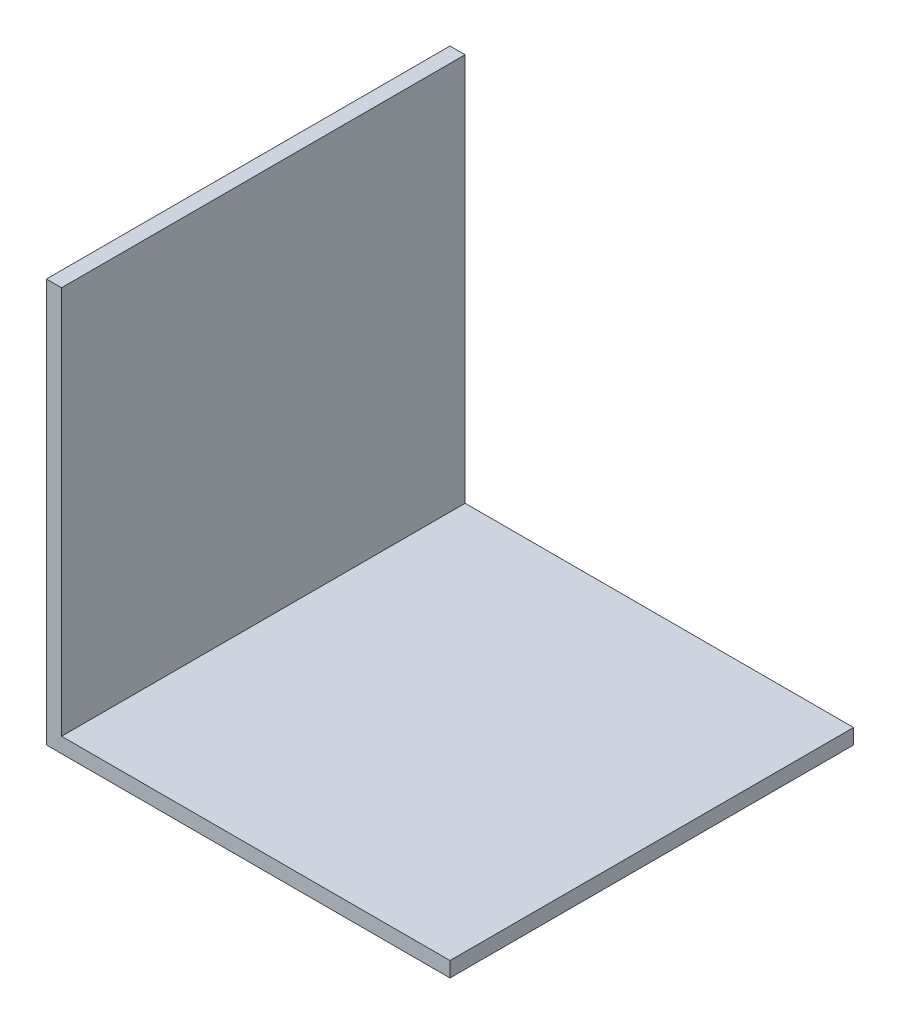
ISO-10303-21;
HEADER;
FILE_DESCRIPTION(('STEP AP214'),'2;1');
FILE_NAME('part.step','',(''),(''),'','','');
FILE_SCHEMA(('AUTOMOTIVE_DESIGN { 1 0 10303 214 1 1 1 1 }'));
ENDSEC;
DATA;
#1=APPLICATION_CONTEXT('core data for automotive mechanical design processes');
#2=APPLICATION_PROTOCOL_DEFINITION('international standard','automotive_design',2000,#1);
#3=PRODUCT_CONTEXT('',#1,'mechanical');
#4=PRODUCT('Part','Part','',(#3));
#5=PRODUCT_RELATED_PRODUCT_CATEGORY('part','',(#4));
#6=PRODUCT_DEFINITION_FORMATION('','',#4);
#7=PRODUCT_DEFINITION_CONTEXT('part definition',#1,'design');
#8=PRODUCT_DEFINITION('design','',#6,#7);
#9=PRODUCT_DEFINITION_SHAPE('','',#8);
#10=(LENGTH_UNIT() NAMED_UNIT(*) SI_UNIT(.MILLI.,.METRE.));
#11=(NAMED_UNIT(*) PLANE_ANGLE_UNIT() SI_UNIT($,.RADIAN.));
#12=(NAMED_UNIT(*) SI_UNIT($,.STERADIAN.) SOLID_ANGLE_UNIT());
#13=UNCERTAINTY_MEASURE_WITH_UNIT(LENGTH_MEASURE(1.E-05),#10,'distance_accuracy_value','');
#14=(GEOMETRIC_REPRESENTATION_CONTEXT(3) GLOBAL_UNCERTAINTY_ASSIGNED_CONTEXT((#13)) GLOBAL_UNIT_ASSIGNED_CONTEXT((#10,
#11,#12)) REPRESENTATION_CONTEXT('',''));
#15=CARTESIAN_POINT('',(0.,0.,0.));
#16=DIRECTION('',(0.,0.,1.));
#17=DIRECTION('',(1.,0.,0.));
#18=AXIS2_PLACEMENT_3D('',#15,#16,#17);
#19=CARTESIAN_POINT('',(0.,40.,40.));
#20=DIRECTION('',(1.,0.,0.));
#21=DIRECTION('',(0.,1.,0.));
#22=AXIS2_PLACEMENT_3D('',#19,#20,#21);
#23=PLANE('',#22);
#24=DIRECTION('',(0.,-1.,0.));
#25=VECTOR('',#24,1.);
#26=CARTESIAN_POINT('',(0.,40.,0.));
#27=LINE('',#26,#25);
#28=CARTESIAN_POINT('',(0.,40.,0.));
#29=VERTEX_POINT('',#28);
#30=CARTESIAN_POINT('',(0.,0.,0.));
#31=VERTEX_POINT('',#30);
#32=EDGE_CURVE('E117',#29,#31,#27,.T.);
#33=ORIENTED_EDGE('',*,*,#32,.T.);
#34=DIRECTION('',(0.,0.,-1.));
#35=VECTOR('',#34,1.);
#36=CARTESIAN_POINT('',(0.,0.,40.));
#37=LINE('',#36,#35);
#38=CARTESIAN_POINT('',(0.,0.,40.));
#39=VERTEX_POINT('',#38);
#40=EDGE_CURVE('E11',#39,#31,#37,.T.);
#41=ORIENTED_EDGE('',*,*,#40,.F.);
#42=DIRECTION('',(0.,-1.,0.));
#43=VECTOR('',#42,1.);
#44=CARTESIAN_POINT('',(0.,40.,40.));
#45=LINE('',#44,#43);
#46=CARTESIAN_POINT('',(0.,40.,40.));
#47=VERTEX_POINT('',#46);
#48=EDGE_CURVE('E127',#47,#39,#45,.T.);
#49=ORIENTED_EDGE('',*,*,#48,.F.);
#50=DIRECTION('',(0.,0.,-1.));
#51=VECTOR('',#50,1.);
#52=CARTESIAN_POINT('',(0.,40.,40.));
#53=LINE('',#52,#51);
#54=EDGE_CURVE('E113',#47,#29,#53,.T.);
#55=ORIENTED_EDGE('',*,*,#54,.T.);
#56=EDGE_LOOP('',(#33,#41,#49,#55));
#57=FACE_BOUND('',#56,.T.);
#58=ADVANCED_FACE('F33',(#57),#23,.F.);
#59=CARTESIAN_POINT('',(0.,0.,40.));
#60=DIRECTION('',(0.,1.,0.));
#61=DIRECTION('',(0.,0.,1.));
#62=AXIS2_PLACEMENT_3D('',#59,#60,#61);
#63=PLANE('',#62);
#64=DIRECTION('',(1.,0.,0.));
#65=VECTOR('',#64,1.);
#66=CARTESIAN_POINT('',(0.,0.,0.));
#67=LINE('',#66,#65);
#68=CARTESIAN_POINT('',(40.,0.,0.));
#69=VERTEX_POINT('',#68);
#70=EDGE_CURVE('E120',#31,#69,#67,.T.);
#71=ORIENTED_EDGE('',*,*,#70,.T.);
#72=DIRECTION('',(0.,0.,-1.));
#73=VECTOR('',#72,1.);
#74=CARTESIAN_POINT('',(40.,0.,40.));
#75=LINE('',#74,#73);
#76=CARTESIAN_POINT('',(40.,0.,40.));
#77=VERTEX_POINT('',#76);
#78=EDGE_CURVE('E41',#77,#69,#75,.T.);
#79=ORIENTED_EDGE('',*,*,#78,.F.);
#80=DIRECTION('',(1.,0.,0.));
#81=VECTOR('',#80,1.);
#82=CARTESIAN_POINT('',(0.,0.,40.));
#83=LINE('',#82,#81);
#84=EDGE_CURVE('E86',#39,#77,#83,.T.);
#85=ORIENTED_EDGE('',*,*,#84,.F.);
#86=ORIENTED_EDGE('',*,*,#40,.T.);
#87=EDGE_LOOP('',(#71,#79,#85,#86));
#88=FACE_BOUND('',#87,.T.);
#89=ADVANCED_FACE('F151',(#88),#63,.F.);
#90=CARTESIAN_POINT('',(40.,0.,40.));
#91=DIRECTION('',(-1.,0.,0.));
#92=DIRECTION('',(0.,0.,1.));
#93=AXIS2_PLACEMENT_3D('',#90,#91,#92);
#94=PLANE('',#93);
#95=DIRECTION('',(0.,1.,0.));
#96=VECTOR('',#95,1.);
#97=CARTESIAN_POINT('',(40.,0.,0.));
#98=LINE('',#97,#96);
#99=CARTESIAN_POINT('',(40.,1.5,0.));
#100=VERTEX_POINT('',#99);
#101=EDGE_CURVE('E122',#69,#100,#98,.T.);
#102=ORIENTED_EDGE('',*,*,#101,.T.);
#103=DIRECTION('',(0.,0.,-1.));
#104=VECTOR('',#103,1.);
#105=CARTESIAN_POINT('',(40.,1.5,40.));
#106=LINE('',#105,#104);
#107=CARTESIAN_POINT('',(40.,1.5,40.));
#108=VERTEX_POINT('',#107);
#109=EDGE_CURVE('E108',#108,#100,#106,.T.);
#110=ORIENTED_EDGE('',*,*,#109,.F.);
#111=DIRECTION('',(0.,1.,0.));
#112=VECTOR('',#111,1.);
#113=CARTESIAN_POINT('',(40.,0.,40.));
#114=LINE('',#113,#112);
#115=EDGE_CURVE('E99',#77,#108,#114,.T.);
#116=ORIENTED_EDGE('',*,*,#115,.F.);
#117=ORIENTED_EDGE('',*,*,#78,.T.);
#118=EDGE_LOOP('',(#102,#110,#116,#117));
#119=FACE_BOUND('',#118,.T.);
#120=ADVANCED_FACE('F133',(#119),#94,.F.);
#121=CARTESIAN_POINT('',(40.,1.5,40.));
#122=DIRECTION('',(0.,-1.,0.));
#123=DIRECTION('',(1.,0.,0.));
#124=AXIS2_PLACEMENT_3D('',#121,#122,#123);
#125=PLANE('',#124);
#126=DIRECTION('',(-1.,0.,0.));
#127=VECTOR('',#126,1.);
#128=CARTESIAN_POINT('',(40.,1.5,0.));
#129=LINE('',#128,#127);
#130=CARTESIAN_POINT('',(1.5,1.5,0.));
#131=VERTEX_POINT('',#130);
#132=EDGE_CURVE('E107',#100,#131,#129,.T.);
#133=ORIENTED_EDGE('',*,*,#132,.T.);
#134=DIRECTION('',(0.,0.,-1.));
#135=VECTOR('',#134,1.);
#136=CARTESIAN_POINT('',(1.5,1.5,40.));
#137=LINE('',#136,#135);
#138=CARTESIAN_POINT('',(1.5,1.5,40.));
#139=VERTEX_POINT('',#138);
#140=EDGE_CURVE('E104',#139,#131,#137,.T.);
#141=ORIENTED_EDGE('',*,*,#140,.F.);
#142=DIRECTION('',(-1.,0.,0.));
#143=VECTOR('',#142,1.);
#144=CARTESIAN_POINT('',(40.,1.5,40.));
#145=LINE('',#144,#143);
#146=EDGE_CURVE('E93',#108,#139,#145,.T.);
#147=ORIENTED_EDGE('',*,*,#146,.F.);
#148=ORIENTED_EDGE('',*,*,#109,.T.);
#149=EDGE_LOOP('',(#133,#141,#147,#148));
#150=FACE_BOUND('',#149,.T.);
#151=ADVANCED_FACE('F105',(#150),#125,.F.);
#152=CARTESIAN_POINT('',(1.5,1.5,40.));
#153=DIRECTION('',(-1.,0.,0.));
#154=DIRECTION('',(0.,-1.,0.));
#155=AXIS2_PLACEMENT_3D('',#152,#153,#154);
#156=PLANE('',#155);
#157=DIRECTION('',(0.,1.,0.));
#158=VECTOR('',#157,1.);
#159=CARTESIAN_POINT('',(1.5,1.5,0.));
#160=LINE('',#159,#158);
#161=CARTESIAN_POINT('',(1.5,40.,0.));
#162=VERTEX_POINT('',#161);
#163=EDGE_CURVE('E72',#131,#162,#160,.T.);
#164=ORIENTED_EDGE('',*,*,#163,.T.);
#165=DIRECTION('',(0.,0.,-1.));
#166=VECTOR('',#165,1.);
#167=CARTESIAN_POINT('',(1.5,40.,40.));
#168=LINE('',#167,#166);
#169=CARTESIAN_POINT('',(1.5,40.,40.));
#170=VERTEX_POINT('',#169);
#171=EDGE_CURVE('E109',#170,#162,#168,.T.);
#172=ORIENTED_EDGE('',*,*,#171,.F.);
#173=DIRECTION('',(0.,1.,0.));
#174=VECTOR('',#173,1.);
#175=CARTESIAN_POINT('',(1.5,1.5,40.));
#176=LINE('',#175,#174);
#177=EDGE_CURVE('E97',#139,#170,#176,.T.);
#178=ORIENTED_EDGE('',*,*,#177,.F.);
#179=ORIENTED_EDGE('',*,*,#140,.T.);
#180=EDGE_LOOP('',(#164,#172,#178,#179));
#181=FACE_BOUND('',#180,.T.);
#182=ADVANCED_FACE('F111',(#181),#156,.F.);
#183=CARTESIAN_POINT('',(1.5,40.,40.));
#184=DIRECTION('',(0.,-1.,0.));
#185=DIRECTION('',(0.,0.,-1.));
#186=AXIS2_PLACEMENT_3D('',#183,#184,#185);
#187=PLANE('',#186);
#188=DIRECTION('',(-1.,0.,0.));
#189=VECTOR('',#188,1.);
#190=CARTESIAN_POINT('',(1.5,40.,0.));
#191=LINE('',#190,#189);
#192=EDGE_CURVE('E78',#162,#29,#191,.T.);
#193=ORIENTED_EDGE('',*,*,#192,.T.);
#194=ORIENTED_EDGE('',*,*,#54,.F.);
#195=DIRECTION('',(-1.,0.,0.));
#196=VECTOR('',#195,1.);
#197=CARTESIAN_POINT('',(1.5,40.,40.));
#198=LINE('',#197,#196);
#199=EDGE_CURVE('E49',#170,#47,#198,.T.);
#200=ORIENTED_EDGE('',*,*,#199,.F.);
#201=ORIENTED_EDGE('',*,*,#171,.T.);
#202=EDGE_LOOP('',(#193,#194,#200,#201));
#203=FACE_BOUND('',#202,.T.);
#204=ADVANCED_FACE('F140',(#203),#187,.F.);
#205=CARTESIAN_POINT('',(0.,0.,40.));
#206=DIRECTION('',(0.,0.,1.));
#207=DIRECTION('',(1.,0.,0.));
#208=AXIS2_PLACEMENT_3D('',#205,#206,#207);
#209=PLANE('',#208);
#210=ORIENTED_EDGE('',*,*,#48,.T.);
#211=ORIENTED_EDGE('',*,*,#84,.T.);
#212=ORIENTED_EDGE('',*,*,#115,.T.);
#213=ORIENTED_EDGE('',*,*,#146,.T.);
#214=ORIENTED_EDGE('',*,*,#177,.T.);
#215=ORIENTED_EDGE('',*,*,#199,.T.);
#216=EDGE_LOOP('',(#210,#211,#212,#213,#214,#215));
#217=FACE_BOUND('',#216,.T.);
#218=ADVANCED_FACE('F95',(#217),#209,.T.);
#219=CARTESIAN_POINT('',(0.,0.,0.));
#220=DIRECTION('',(0.,0.,1.));
#221=DIRECTION('',(1.,0.,0.));
#222=AXIS2_PLACEMENT_3D('',#219,#220,#221);
#223=PLANE('',#222);
#224=ORIENTED_EDGE('',*,*,#32,.F.);
#225=ORIENTED_EDGE('',*,*,#192,.F.);
#226=ORIENTED_EDGE('',*,*,#163,.F.);
#227=ORIENTED_EDGE('',*,*,#132,.F.);
#228=ORIENTED_EDGE('',*,*,#101,.F.);
#229=ORIENTED_EDGE('',*,*,#70,.F.);
#230=EDGE_LOOP('',(#224,#225,#226,#227,#228,#229));
#231=FACE_BOUND('',#230,.T.);
#232=ADVANCED_FACE('F136',(#231),#223,.F.);
#233=CLOSED_SHELL('',(#58,#89,#120,#151,#182,#204,#218,#232));
#234=MANIFOLD_SOLID_BREP('B2',#233);
#235=ADVANCED_BREP_SHAPE_REPRESENTATION('',(#18,#234),#14);
#236=SHAPE_DEFINITION_REPRESENTATION(#9,#235);
ENDSEC;
END-ISO-10303-21;
